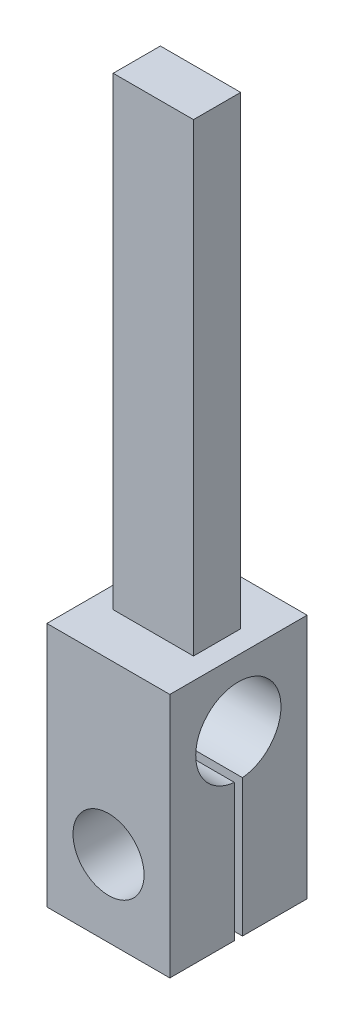
ISO-10303-21;
HEADER;
FILE_DESCRIPTION(('STEP AP214'),'2;1');
FILE_NAME('part.step','',(''),(''),'','','');
FILE_SCHEMA(('AUTOMOTIVE_DESIGN { 1 0 10303 214 1 1 1 1 }'));
ENDSEC;
DATA;
#1=APPLICATION_CONTEXT('core data for automotive mechanical design processes');
#2=APPLICATION_PROTOCOL_DEFINITION('international standard','automotive_design',2000,#1);
#3=PRODUCT_CONTEXT('',#1,'mechanical');
#4=PRODUCT('Part','Part','',(#3));
#5=PRODUCT_RELATED_PRODUCT_CATEGORY('part','',(#4));
#6=PRODUCT_DEFINITION_FORMATION('','',#4);
#7=PRODUCT_DEFINITION_CONTEXT('part definition',#1,'design');
#8=PRODUCT_DEFINITION('design','',#6,#7);
#9=PRODUCT_DEFINITION_SHAPE('','',#8);
#10=(LENGTH_UNIT() NAMED_UNIT(*) SI_UNIT(.MILLI.,.METRE.));
#11=(NAMED_UNIT(*) PLANE_ANGLE_UNIT() SI_UNIT($,.RADIAN.));
#12=(NAMED_UNIT(*) SI_UNIT($,.STERADIAN.) SOLID_ANGLE_UNIT());
#13=UNCERTAINTY_MEASURE_WITH_UNIT(LENGTH_MEASURE(1.E-05),#10,'distance_accuracy_value','');
#14=(GEOMETRIC_REPRESENTATION_CONTEXT(3) GLOBAL_UNCERTAINTY_ASSIGNED_CONTEXT((#13)) GLOBAL_UNIT_ASSIGNED_CONTEXT((#10,
#11,#12)) REPRESENTATION_CONTEXT('',''));
#15=CARTESIAN_POINT('',(0.,0.,0.));
#16=DIRECTION('',(0.,0.,1.));
#17=DIRECTION('',(1.,0.,0.));
#18=AXIS2_PLACEMENT_3D('',#15,#16,#17);
#19=CARTESIAN_POINT('',(4.5,-0.928463249188956,-1.55613054033977));
#20=DIRECTION('',(0.,-1.,0.));
#21=DIRECTION('',(0.,0.,-1.));
#22=AXIS2_PLACEMENT_3D('',#19,#20,#21);
#23=PLANE('',#22);
#24=DIRECTION('',(0.,0.,1.));
#25=VECTOR('',#24,1.);
#26=CARTESIAN_POINT('',(0.,-0.928463249188956,-1.55613054033977));
#27=LINE('',#26,#25);
#28=CARTESIAN_POINT('',(0.,-0.928463249188956,-6.57967408053012));
#29=VERTEX_POINT('',#28);
#30=CARTESIAN_POINT('',(0.,-0.928463249188956,-1.55613054033977));
#31=VERTEX_POINT('',#30);
#32=EDGE_CURVE('E205',#29,#31,#27,.T.);
#33=ORIENTED_EDGE('',*,*,#32,.T.);
#34=DIRECTION('',(-1.,0.,0.));
#35=VECTOR('',#34,1.);
#36=CARTESIAN_POINT('',(4.5,-0.928463249188956,-1.55613054033977));
#37=LINE('',#36,#35);
#38=CARTESIAN_POINT('',(4.5,-0.928463249188956,-1.55613054033977));
#39=VERTEX_POINT('',#38);
#40=EDGE_CURVE('E241',#39,#31,#37,.T.);
#41=ORIENTED_EDGE('',*,*,#40,.F.);
#42=DIRECTION('',(0.,0.,1.));
#43=VECTOR('',#42,1.);
#44=CARTESIAN_POINT('',(4.5,-0.928463249188956,-1.55613054033977));
#45=LINE('',#44,#43);
#46=CARTESIAN_POINT('',(4.5,-0.928463249188956,-6.57967408053012));
#47=VERTEX_POINT('',#46);
#48=EDGE_CURVE('E180',#47,#39,#45,.T.);
#49=ORIENTED_EDGE('',*,*,#48,.F.);
#50=DIRECTION('',(-1.,0.,0.));
#51=VECTOR('',#50,1.);
#52=CARTESIAN_POINT('',(4.5,-0.928463249188956,-6.57967408053012));
#53=LINE('',#52,#51);
#54=EDGE_CURVE('E49',#47,#29,#53,.T.);
#55=ORIENTED_EDGE('',*,*,#54,.T.);
#56=EDGE_LOOP('',(#33,#41,#49,#55));
#57=FACE_BOUND('',#56,.T.);
#58=DIRECTION('',(0.,0.,1.));
#59=VECTOR('',#58,1.);
#60=CARTESIAN_POINT('',(0.777878720807035,-0.928463249188956,-4.93140427743866));
#61=LINE('',#60,#59);
#62=CARTESIAN_POINT('',(0.777878720807035,-0.928463249188956,-4.93140427743866));
#63=VERTEX_POINT('',#62);
#64=CARTESIAN_POINT('',(0.777878720807035,-0.928463249188956,-3.20440231043494));
#65=VERTEX_POINT('',#64);
#66=EDGE_CURVE('E56',#63,#65,#61,.T.);
#67=ORIENTED_EDGE('',*,*,#66,.F.);
#68=DIRECTION('',(-1.,0.,0.));
#69=VECTOR('',#68,1.);
#70=CARTESIAN_POINT('',(0.777878720807035,-0.928463249188956,-4.93140427743866));
#71=LINE('',#70,#69);
#72=CARTESIAN_POINT('',(3.71643523730367,-0.928463249188956,-4.93140427743866));
#73=VERTEX_POINT('',#72);
#74=EDGE_CURVE('E60',#73,#63,#71,.T.);
#75=ORIENTED_EDGE('',*,*,#74,.F.);
#76=DIRECTION('',(0.,0.,-1.));
#77=VECTOR('',#76,1.);
#78=CARTESIAN_POINT('',(3.71643523730367,-0.928463249188956,-3.20440231043494));
#79=LINE('',#78,#77);
#80=CARTESIAN_POINT('',(3.71643523730367,-0.928463249188956,-3.20440231043494));
#81=VERTEX_POINT('',#80);
#82=EDGE_CURVE('E447',#81,#73,#79,.T.);
#83=ORIENTED_EDGE('',*,*,#82,.F.);
#84=DIRECTION('',(1.,0.,0.));
#85=VECTOR('',#84,1.);
#86=CARTESIAN_POINT('',(0.777878720807035,-0.928463249188956,-3.20440231043494));
#87=LINE('',#86,#85);
#88=EDGE_CURVE('E457',#65,#81,#87,.T.);
#89=ORIENTED_EDGE('',*,*,#88,.F.);
#90=EDGE_LOOP('',(#67,#75,#83,#89));
#91=FACE_BOUND('',#90,.T.);
#92=ADVANCED_FACE('F39',(#57,#91),#23,.F.);
#93=CARTESIAN_POINT('',(4.5,-9.91643635393668,-4.21480446225986));
#94=DIRECTION('',(0.,0.999999923726654,-0.000390572255170057));
#95=DIRECTION('',(0.,0.000390572255170057,0.999999923726654));
#96=AXIS2_PLACEMENT_3D('',#93,#94,#95);
#97=PLANE('',#96);
#98=DIRECTION('',(0.,-0.000390572255170057,-0.999999923726654));
#99=VECTOR('',#98,1.);
#100=CARTESIAN_POINT('',(0.,-9.91643635393668,-4.21480446225986));
#101=LINE('',#100,#99);
#102=CARTESIAN_POINT('',(0.,-9.91643635393668,-4.21480446225986));
#103=VERTEX_POINT('',#102);
#104=CARTESIAN_POINT('',(0.,-9.91736000646712,-6.57967408053012));
#105=VERTEX_POINT('',#104);
#106=EDGE_CURVE('E171',#103,#105,#101,.T.);
#107=ORIENTED_EDGE('',*,*,#106,.T.);
#108=DIRECTION('',(-1.,0.,0.));
#109=VECTOR('',#108,1.);
#110=CARTESIAN_POINT('',(4.5,-9.91736000646712,-6.57967408053012));
#111=LINE('',#110,#109);
#112=CARTESIAN_POINT('',(4.5,-9.91736000646712,-6.57967408053012));
#113=VERTEX_POINT('',#112);
#114=EDGE_CURVE('E11',#113,#105,#111,.T.);
#115=ORIENTED_EDGE('',*,*,#114,.F.);
#116=DIRECTION('',(0.,-0.000390572255170057,-0.999999923726654));
#117=VECTOR('',#116,1.);
#118=CARTESIAN_POINT('',(4.5,-9.91643635393668,-4.21480446225986));
#119=LINE('',#118,#117);
#120=CARTESIAN_POINT('',(4.5,-9.91643635393668,-4.21480446225986));
#121=VERTEX_POINT('',#120);
#122=EDGE_CURVE('E172',#121,#113,#119,.T.);
#123=ORIENTED_EDGE('',*,*,#122,.F.);
#124=DIRECTION('',(-1.,0.,0.));
#125=VECTOR('',#124,1.);
#126=CARTESIAN_POINT('',(4.5,-9.91643635393668,-4.21480446225986));
#127=LINE('',#126,#125);
#128=EDGE_CURVE('E198',#121,#103,#127,.T.);
#129=ORIENTED_EDGE('',*,*,#128,.T.);
#130=EDGE_LOOP('',(#107,#115,#123,#129));
#131=FACE_BOUND('',#130,.T.);
#132=ADVANCED_FACE('F41',(#131),#97,.F.);
#133=CARTESIAN_POINT('',(4.5,-9.91736000646712,-6.57967408053012));
#134=DIRECTION('',(0.,0.,1.));
#135=DIRECTION('',(1.,0.,0.));
#136=AXIS2_PLACEMENT_3D('',#133,#134,#135);
#137=PLANE('',#136);
#138=CARTESIAN_POINT('',(2.25602954331805,-7.12173193538312,-6.57967408053012));
#139=DIRECTION('',(0.,0.,1.));
#140=DIRECTION('',(1.,0.,0.));
#141=AXIS2_PLACEMENT_3D('',#138,#139,#140);
#142=CIRCLE('',#141,1.3);
#143=CARTESIAN_POINT('',(3.55602954331805,-7.12173193538312,-6.57967408053012));
#144=VERTEX_POINT('',#143);
#145=EDGE_CURVE('E167',#144,#144,#142,.T.);
#146=ORIENTED_EDGE('',*,*,#145,.T.);
#147=EDGE_LOOP('',(#146));
#148=FACE_BOUND('',#147,.T.);
#149=DIRECTION('',(0.,1.,0.));
#150=VECTOR('',#149,1.);
#151=CARTESIAN_POINT('',(0.,-9.91736000646712,-6.57967408053012));
#152=LINE('',#151,#150);
#153=EDGE_CURVE('E202',#105,#29,#152,.T.);
#154=ORIENTED_EDGE('',*,*,#153,.T.);
#155=ORIENTED_EDGE('',*,*,#54,.F.);
#156=DIRECTION('',(0.,1.,0.));
#157=VECTOR('',#156,1.);
#158=CARTESIAN_POINT('',(4.5,-9.91736000646712,-6.57967408053012));
#159=LINE('',#158,#157);
#160=EDGE_CURVE('E176',#113,#47,#159,.T.);
#161=ORIENTED_EDGE('',*,*,#160,.F.);
#162=ORIENTED_EDGE('',*,*,#114,.T.);
#163=EDGE_LOOP('',(#154,#155,#161,#162));
#164=FACE_BOUND('',#163,.T.);
#165=ADVANCED_FACE('F273',(#148,#164),#137,.F.);
#166=CARTESIAN_POINT('',(4.5,-0.928463249188956,-1.55613054033977));
#167=DIRECTION('',(0.,0.,-1.));
#168=DIRECTION('',(-1.,0.,0.));
#169=AXIS2_PLACEMENT_3D('',#166,#167,#168);
#170=PLANE('',#169);
#171=CARTESIAN_POINT('',(2.25602954331805,-7.12173193538312,-1.55613054033977));
#172=DIRECTION('',(0.,0.,1.));
#173=DIRECTION('',(1.,0.,0.));
#174=AXIS2_PLACEMENT_3D('',#171,#172,#173);
#175=CIRCLE('',#174,1.3);
#176=CARTESIAN_POINT('',(3.55602954331805,-7.12173193538312,-1.55613054033977));
#177=VERTEX_POINT('',#176);
#178=EDGE_CURVE('E153',#177,#177,#175,.T.);
#179=ORIENTED_EDGE('',*,*,#178,.F.);
#180=EDGE_LOOP('',(#179));
#181=FACE_BOUND('',#180,.T.);
#182=DIRECTION('',(0.,-1.,0.));
#183=VECTOR('',#182,1.);
#184=CARTESIAN_POINT('',(0.,-0.928463249188956,-1.55613054033977));
#185=LINE('',#184,#183);
#186=CARTESIAN_POINT('',(0.,-9.91539794958803,-1.55613054033977));
#187=VERTEX_POINT('',#186);
#188=EDGE_CURVE('E208',#31,#187,#185,.T.);
#189=ORIENTED_EDGE('',*,*,#188,.T.);
#190=DIRECTION('',(-1.,0.,0.));
#191=VECTOR('',#190,1.);
#192=CARTESIAN_POINT('',(4.5,-9.91539794958803,-1.55613054033977));
#193=LINE('',#192,#191);
#194=CARTESIAN_POINT('',(4.5,-9.91539794958803,-1.55613054033977));
#195=VERTEX_POINT('',#194);
#196=EDGE_CURVE('E237',#195,#187,#193,.T.);
#197=ORIENTED_EDGE('',*,*,#196,.F.);
#198=DIRECTION('',(0.,-1.,0.));
#199=VECTOR('',#198,1.);
#200=CARTESIAN_POINT('',(4.5,-0.928463249188956,-1.55613054033977));
#201=LINE('',#200,#199);
#202=EDGE_CURVE('E183',#39,#195,#201,.T.);
#203=ORIENTED_EDGE('',*,*,#202,.F.);
#204=ORIENTED_EDGE('',*,*,#40,.T.);
#205=EDGE_LOOP('',(#189,#197,#203,#204));
#206=FACE_BOUND('',#205,.T.);
#207=ADVANCED_FACE('F261',(#181,#206),#170,.F.);
#208=CARTESIAN_POINT('',(4.5,-9.91539794958803,-1.55613054033977));
#209=DIRECTION('',(0.,0.999999923726654,-0.000390572255169767));
#210=DIRECTION('',(0.,0.000390572255169767,0.999999923726654));
#211=AXIS2_PLACEMENT_3D('',#208,#209,#210);
#212=PLANE('',#211);
#213=DIRECTION('',(0.,-0.000390572255169767,-0.999999923726654));
#214=VECTOR('',#213,1.);
#215=CARTESIAN_POINT('',(0.,-9.91539794958803,-1.55613054033977));
#216=LINE('',#215,#214);
#217=CARTESIAN_POINT('',(0.,-9.91631984377836,-3.91649820038695));
#218=VERTEX_POINT('',#217);
#219=EDGE_CURVE('E211',#187,#218,#216,.T.);
#220=ORIENTED_EDGE('',*,*,#219,.T.);
#221=DIRECTION('',(-1.,0.,0.));
#222=VECTOR('',#221,1.);
#223=CARTESIAN_POINT('',(4.5,-9.91631984377836,-3.91649820038695));
#224=LINE('',#223,#222);
#225=CARTESIAN_POINT('',(4.5,-9.91631984377836,-3.91649820038695));
#226=VERTEX_POINT('',#225);
#227=EDGE_CURVE('E233',#226,#218,#224,.T.);
#228=ORIENTED_EDGE('',*,*,#227,.F.);
#229=DIRECTION('',(0.,-0.000390572255169767,-0.999999923726654));
#230=VECTOR('',#229,1.);
#231=CARTESIAN_POINT('',(4.5,-9.91539794958803,-1.55613054033977));
#232=LINE('',#231,#230);
#233=EDGE_CURVE('E186',#195,#226,#232,.T.);
#234=ORIENTED_EDGE('',*,*,#233,.F.);
#235=ORIENTED_EDGE('',*,*,#196,.T.);
#236=EDGE_LOOP('',(#220,#228,#234,#235));
#237=FACE_BOUND('',#236,.T.);
#238=ADVANCED_FACE('F265',(#237),#212,.F.);
#239=CARTESIAN_POINT('',(4.5,-4.89556335389052,-3.91649820038695));
#240=DIRECTION('',(0.,0.,1.));
#241=DIRECTION('',(0.,-1.,0.));
#242=AXIS2_PLACEMENT_3D('',#239,#240,#241);
#243=PLANE('',#242);
#244=CARTESIAN_POINT('',(2.25602954331805,-7.12173193538312,-3.91649820038695));
#245=DIRECTION('',(0.,0.,1.));
#246=DIRECTION('',(0.,-1.,0.));
#247=AXIS2_PLACEMENT_3D('',#244,#245,#246);
#248=CIRCLE('',#247,1.3);
#249=CARTESIAN_POINT('',(2.25602954331805,-8.42173193538312,-3.91649820038695));
#250=VERTEX_POINT('',#249);
#251=EDGE_CURVE('E163',#250,#250,#248,.T.);
#252=ORIENTED_EDGE('',*,*,#251,.T.);
#253=EDGE_LOOP('',(#252));
#254=FACE_BOUND('',#253,.T.);
#255=DIRECTION('',(0.,1.,0.));
#256=VECTOR('',#255,1.);
#257=CARTESIAN_POINT('',(0.,-4.89556335389052,-3.91649820038695));
#258=LINE('',#257,#256);
#259=CARTESIAN_POINT('',(0.,-4.89556335389052,-3.91649820038695));
#260=VERTEX_POINT('',#259);
#261=EDGE_CURVE('E214',#218,#260,#258,.T.);
#262=ORIENTED_EDGE('',*,*,#261,.T.);
#263=DIRECTION('',(-1.,0.,0.));
#264=VECTOR('',#263,1.);
#265=CARTESIAN_POINT('',(4.5,-4.89556335389052,-3.91649820038695));
#266=LINE('',#265,#264);
#267=CARTESIAN_POINT('',(4.5,-4.89556335389052,-3.91649820038695));
#268=VERTEX_POINT('',#267);
#269=EDGE_CURVE('E229',#268,#260,#266,.T.);
#270=ORIENTED_EDGE('',*,*,#269,.F.);
#271=DIRECTION('',(0.,1.,0.));
#272=VECTOR('',#271,1.);
#273=CARTESIAN_POINT('',(4.5,-4.89556335389052,-3.91649820038695));
#274=LINE('',#273,#272);
#275=EDGE_CURVE('E189',#226,#268,#274,.T.);
#276=ORIENTED_EDGE('',*,*,#275,.F.);
#277=ORIENTED_EDGE('',*,*,#227,.T.);
#278=EDGE_LOOP('',(#262,#270,#276,#277));
#279=FACE_BOUND('',#278,.T.);
#280=ADVANCED_FACE('F286',(#254,#279),#243,.F.);
#281=CARTESIAN_POINT('',(4.5,-3.34244148680697,-4.0628281904331));
#282=DIRECTION('',(-1.,0.,0.));
#283=DIRECTION('',(0.,0.,1.));
#284=AXIS2_PLACEMENT_3D('',#281,#282,#283);
#285=CYLINDRICAL_SURFACE('',#284,1.56);
#286=CARTESIAN_POINT('',(0.,-3.34244148680697,-4.0628281904331));
#287=DIRECTION('',(-1.,0.,0.));
#288=DIRECTION('',(0.,0.,-1.));
#289=AXIS2_PLACEMENT_3D('',#286,#287,#288);
#290=CIRCLE('',#289,1.56);
#291=CARTESIAN_POINT('',(0.,-4.89502102190385,-4.21480446225986));
#292=VERTEX_POINT('',#291);
#293=EDGE_CURVE('E217',#260,#292,#290,.T.);
#294=ORIENTED_EDGE('',*,*,#293,.T.);
#295=DIRECTION('',(-1.,0.,0.));
#296=VECTOR('',#295,1.);
#297=CARTESIAN_POINT('',(4.5,-4.89502102190385,-4.21480446225986));
#298=LINE('',#297,#296);
#299=CARTESIAN_POINT('',(4.5,-4.89502102190385,-4.21480446225986));
#300=VERTEX_POINT('',#299);
#301=EDGE_CURVE('E225',#300,#292,#298,.T.);
#302=ORIENTED_EDGE('',*,*,#301,.F.);
#303=CARTESIAN_POINT('',(4.5,-3.34244148680697,-4.0628281904331));
#304=DIRECTION('',(-1.,0.,0.));
#305=DIRECTION('',(0.,0.,-1.));
#306=AXIS2_PLACEMENT_3D('',#303,#304,#305);
#307=CIRCLE('',#306,1.56);
#308=EDGE_CURVE('E192',#268,#300,#307,.T.);
#309=ORIENTED_EDGE('',*,*,#308,.F.);
#310=ORIENTED_EDGE('',*,*,#269,.T.);
#311=EDGE_LOOP('',(#294,#302,#309,#310));
#312=FACE_BOUND('',#311,.T.);
#313=ADVANCED_FACE('F284',(#312),#285,.F.);
#314=CARTESIAN_POINT('',(4.5,-4.89502102190385,-4.21480446225986));
#315=DIRECTION('',(0.,0.,-1.));
#316=DIRECTION('',(0.,1.,0.));
#317=AXIS2_PLACEMENT_3D('',#314,#315,#316);
#318=PLANE('',#317);
#319=CARTESIAN_POINT('',(2.25602954331805,-7.12173193538312,-4.21480446225986));
#320=DIRECTION('',(0.,0.,-1.));
#321=DIRECTION('',(0.,1.,0.));
#322=AXIS2_PLACEMENT_3D('',#319,#320,#321);
#323=CIRCLE('',#322,1.3);
#324=CARTESIAN_POINT('',(2.25602954331805,-5.82173193538312,-4.21480446225986));
#325=VERTEX_POINT('',#324);
#326=EDGE_CURVE('E43',#325,#325,#323,.T.);
#327=ORIENTED_EDGE('',*,*,#326,.T.);
#328=EDGE_LOOP('',(#327));
#329=FACE_BOUND('',#328,.T.);
#330=DIRECTION('',(0.,-1.,0.));
#331=VECTOR('',#330,1.);
#332=CARTESIAN_POINT('',(0.,-4.89502102190385,-4.21480446225986));
#333=LINE('',#332,#331);
#334=EDGE_CURVE('E177',#292,#103,#333,.T.);
#335=ORIENTED_EDGE('',*,*,#334,.T.);
#336=ORIENTED_EDGE('',*,*,#128,.F.);
#337=DIRECTION('',(0.,-1.,0.));
#338=VECTOR('',#337,1.);
#339=CARTESIAN_POINT('',(4.5,-4.89502102190385,-4.21480446225986));
#340=LINE('',#339,#338);
#341=EDGE_CURVE('E195',#300,#121,#340,.T.);
#342=ORIENTED_EDGE('',*,*,#341,.F.);
#343=ORIENTED_EDGE('',*,*,#301,.T.);
#344=EDGE_LOOP('',(#335,#336,#342,#343));
#345=FACE_BOUND('',#344,.T.);
#346=ADVANCED_FACE('F279',(#329,#345),#318,.F.);
#347=CARTESIAN_POINT('',(4.5,-3.34244148680697,-4.0628281904331));
#348=DIRECTION('',(1.,0.,0.));
#349=DIRECTION('',(0.,0.,-1.));
#350=AXIS2_PLACEMENT_3D('',#347,#348,#349);
#351=PLANE('',#350);
#352=ORIENTED_EDGE('',*,*,#122,.T.);
#353=ORIENTED_EDGE('',*,*,#160,.T.);
#354=ORIENTED_EDGE('',*,*,#48,.T.);
#355=ORIENTED_EDGE('',*,*,#202,.T.);
#356=ORIENTED_EDGE('',*,*,#233,.T.);
#357=ORIENTED_EDGE('',*,*,#275,.T.);
#358=ORIENTED_EDGE('',*,*,#308,.T.);
#359=ORIENTED_EDGE('',*,*,#341,.T.);
#360=EDGE_LOOP('',(#352,#353,#354,#355,#356,#357,#358,#359));
#361=FACE_BOUND('',#360,.T.);
#362=ADVANCED_FACE('F269',(#361),#351,.T.);
#363=CARTESIAN_POINT('',(0.,-3.34244148680697,-4.0628281904331));
#364=DIRECTION('',(1.,0.,0.));
#365=DIRECTION('',(0.,0.,-1.));
#366=AXIS2_PLACEMENT_3D('',#363,#364,#365);
#367=PLANE('',#366);
#368=ORIENTED_EDGE('',*,*,#106,.F.);
#369=ORIENTED_EDGE('',*,*,#334,.F.);
#370=ORIENTED_EDGE('',*,*,#293,.F.);
#371=ORIENTED_EDGE('',*,*,#261,.F.);
#372=ORIENTED_EDGE('',*,*,#219,.F.);
#373=ORIENTED_EDGE('',*,*,#188,.F.);
#374=ORIENTED_EDGE('',*,*,#32,.F.);
#375=ORIENTED_EDGE('',*,*,#153,.F.);
#376=EDGE_LOOP('',(#368,#369,#370,#371,#372,#373,#374,#375));
#377=FACE_BOUND('',#376,.T.);
#378=ADVANCED_FACE('F256',(#377),#367,.F.);
#379=CARTESIAN_POINT('',(2.25602954331805,-7.12173193538312,-12.0561305403398));
#380=DIRECTION('',(0.,0.,1.));
#381=DIRECTION('',(1.,0.,0.));
#382=AXIS2_PLACEMENT_3D('',#379,#380,#381);
#383=CYLINDRICAL_SURFACE('',#382,1.3);
#384=ORIENTED_EDGE('',*,*,#326,.F.);
#385=EDGE_LOOP('',(#384));
#386=FACE_BOUND('',#385,.T.);
#387=ORIENTED_EDGE('',*,*,#145,.F.);
#388=EDGE_LOOP('',(#387));
#389=FACE_BOUND('',#388,.T.);
#390=ADVANCED_FACE('F310',(#386,#389),#383,.F.);
#391=ORIENTED_EDGE('',*,*,#178,.T.);
#392=EDGE_LOOP('',(#391));
#393=FACE_BOUND('',#392,.T.);
#394=ORIENTED_EDGE('',*,*,#251,.F.);
#395=EDGE_LOOP('',(#394));
#396=FACE_BOUND('',#395,.T.);
#397=ADVANCED_FACE('F312',(#393,#396),#383,.F.);
#398=CARTESIAN_POINT('',(0.777878720807035,16.071536750811,-4.93140427743866));
#399=DIRECTION('',(1.,0.,0.));
#400=DIRECTION('',(0.,0.,-1.));
#401=AXIS2_PLACEMENT_3D('',#398,#399,#400);
#402=PLANE('',#401);
#403=ORIENTED_EDGE('',*,*,#66,.T.);
#404=DIRECTION('',(0.,-1.,0.));
#405=VECTOR('',#404,1.);
#406=CARTESIAN_POINT('',(0.777878720807035,16.071536750811,-3.20440231043494));
#407=LINE('',#406,#405);
#408=CARTESIAN_POINT('',(0.777878720807035,16.071536750811,-3.20440231043494));
#409=VERTEX_POINT('',#408);
#410=EDGE_CURVE('E133',#409,#65,#407,.T.);
#411=ORIENTED_EDGE('',*,*,#410,.F.);
#412=DIRECTION('',(0.,0.,1.));
#413=VECTOR('',#412,1.);
#414=CARTESIAN_POINT('',(0.777878720807035,16.071536750811,-4.93140427743866));
#415=LINE('',#414,#413);
#416=CARTESIAN_POINT('',(0.777878720807035,16.071536750811,-4.93140427743866));
#417=VERTEX_POINT('',#416);
#418=EDGE_CURVE('E140',#417,#409,#415,.T.);
#419=ORIENTED_EDGE('',*,*,#418,.F.);
#420=DIRECTION('',(0.,-1.,0.));
#421=VECTOR('',#420,1.);
#422=CARTESIAN_POINT('',(0.777878720807035,16.071536750811,-4.93140427743866));
#423=LINE('',#422,#421);
#424=EDGE_CURVE('E444',#417,#63,#423,.T.);
#425=ORIENTED_EDGE('',*,*,#424,.T.);
#426=EDGE_LOOP('',(#403,#411,#419,#425));
#427=FACE_BOUND('',#426,.T.);
#428=ADVANCED_FACE('F151',(#427),#402,.F.);
#429=CARTESIAN_POINT('',(0.777878720807035,16.071536750811,-3.20440231043494));
#430=DIRECTION('',(0.,0.,-1.));
#431=DIRECTION('',(-1.,0.,0.));
#432=AXIS2_PLACEMENT_3D('',#429,#430,#431);
#433=PLANE('',#432);
#434=ORIENTED_EDGE('',*,*,#88,.T.);
#435=DIRECTION('',(0.,-1.,0.));
#436=VECTOR('',#435,1.);
#437=CARTESIAN_POINT('',(3.71643523730367,16.071536750811,-3.20440231043494));
#438=LINE('',#437,#436);
#439=CARTESIAN_POINT('',(3.71643523730367,16.071536750811,-3.20440231043494));
#440=VERTEX_POINT('',#439);
#441=EDGE_CURVE('E135',#440,#81,#438,.T.);
#442=ORIENTED_EDGE('',*,*,#441,.F.);
#443=DIRECTION('',(1.,0.,0.));
#444=VECTOR('',#443,1.);
#445=CARTESIAN_POINT('',(0.777878720807035,16.071536750811,-3.20440231043494));
#446=LINE('',#445,#444);
#447=EDGE_CURVE('E128',#409,#440,#446,.T.);
#448=ORIENTED_EDGE('',*,*,#447,.F.);
#449=ORIENTED_EDGE('',*,*,#410,.T.);
#450=EDGE_LOOP('',(#434,#442,#448,#449));
#451=FACE_BOUND('',#450,.T.);
#452=ADVANCED_FACE('F131',(#451),#433,.F.);
#453=CARTESIAN_POINT('',(3.71643523730367,16.071536750811,-3.20440231043494));
#454=DIRECTION('',(-1.,0.,0.));
#455=DIRECTION('',(0.,0.,1.));
#456=AXIS2_PLACEMENT_3D('',#453,#454,#455);
#457=PLANE('',#456);
#458=ORIENTED_EDGE('',*,*,#82,.T.);
#459=DIRECTION('',(0.,-1.,0.));
#460=VECTOR('',#459,1.);
#461=CARTESIAN_POINT('',(3.71643523730367,16.071536750811,-4.93140427743866));
#462=LINE('',#461,#460);
#463=CARTESIAN_POINT('',(3.71643523730367,16.071536750811,-4.93140427743866));
#464=VERTEX_POINT('',#463);
#465=EDGE_CURVE('E159',#464,#73,#462,.T.);
#466=ORIENTED_EDGE('',*,*,#465,.F.);
#467=DIRECTION('',(0.,0.,-1.));
#468=VECTOR('',#467,1.);
#469=CARTESIAN_POINT('',(3.71643523730367,16.071536750811,-3.20440231043494));
#470=LINE('',#469,#468);
#471=EDGE_CURVE('E139',#440,#464,#470,.T.);
#472=ORIENTED_EDGE('',*,*,#471,.F.);
#473=ORIENTED_EDGE('',*,*,#441,.T.);
#474=EDGE_LOOP('',(#458,#466,#472,#473));
#475=FACE_BOUND('',#474,.T.);
#476=ADVANCED_FACE('F412',(#475),#457,.F.);
#477=CARTESIAN_POINT('',(0.777878720807035,16.071536750811,-4.93140427743866));
#478=DIRECTION('',(0.,0.,1.));
#479=DIRECTION('',(1.,0.,0.));
#480=AXIS2_PLACEMENT_3D('',#477,#478,#479);
#481=PLANE('',#480);
#482=ORIENTED_EDGE('',*,*,#74,.T.);
#483=ORIENTED_EDGE('',*,*,#424,.F.);
#484=DIRECTION('',(-1.,0.,0.));
#485=VECTOR('',#484,1.);
#486=CARTESIAN_POINT('',(0.777878720807035,16.071536750811,-4.93140427743866));
#487=LINE('',#486,#485);
#488=EDGE_CURVE('E145',#464,#417,#487,.T.);
#489=ORIENTED_EDGE('',*,*,#488,.F.);
#490=ORIENTED_EDGE('',*,*,#465,.T.);
#491=EDGE_LOOP('',(#482,#483,#489,#490));
#492=FACE_BOUND('',#491,.T.);
#493=ADVANCED_FACE('F419',(#492),#481,.F.);
#494=CARTESIAN_POINT('',(0.,16.071536750811,0.));
#495=DIRECTION('',(0.,1.,0.));
#496=DIRECTION('',(0.,0.,1.));
#497=AXIS2_PLACEMENT_3D('',#494,#495,#496);
#498=PLANE('',#497);
#499=ORIENTED_EDGE('',*,*,#418,.T.);
#500=ORIENTED_EDGE('',*,*,#447,.T.);
#501=ORIENTED_EDGE('',*,*,#471,.T.);
#502=ORIENTED_EDGE('',*,*,#488,.T.);
#503=EDGE_LOOP('',(#499,#500,#501,#502));
#504=FACE_BOUND('',#503,.T.);
#505=ADVANCED_FACE('F143',(#504),#498,.T.);
#506=CLOSED_SHELL('',(#92,#132,#165,#207,#238,#280,#313,#346,#362,#378,#390,#397,#428,#452,#476,
#493,#505));
#507=MANIFOLD_SOLID_BREP('B2',#506);
#508=ADVANCED_BREP_SHAPE_REPRESENTATION('',(#18,#507),#14);
#509=SHAPE_DEFINITION_REPRESENTATION(#9,#508);
ENDSEC;
END-ISO-10303-21;
